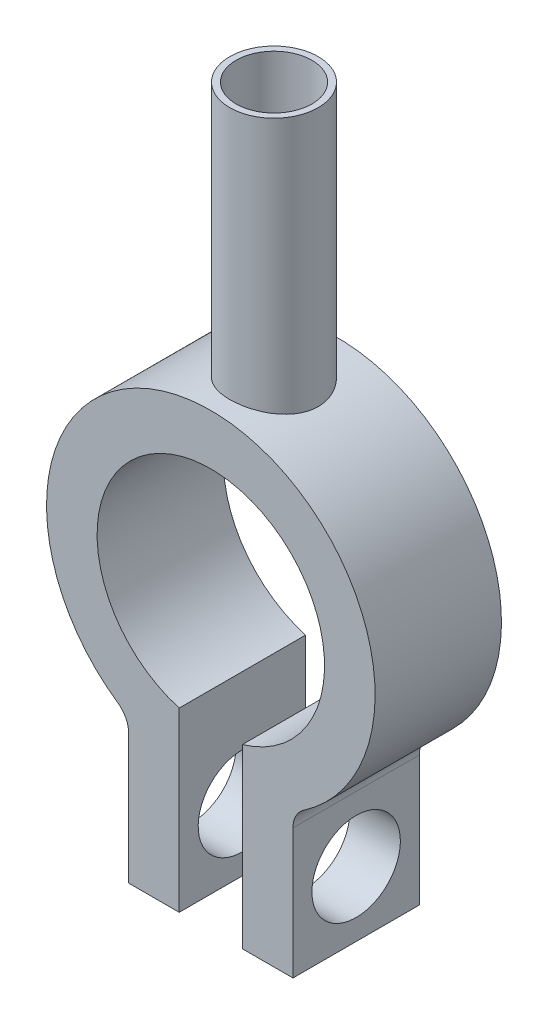
ISO-10303-21;
HEADER;
FILE_DESCRIPTION(('STEP AP214'),'2;1');
FILE_NAME('part.step','',(''),(''),'','','');
FILE_SCHEMA(('AUTOMOTIVE_DESIGN { 1 0 10303 214 1 1 1 1 }'));
ENDSEC;
DATA;
#1=APPLICATION_CONTEXT('core data for automotive mechanical design processes');
#2=APPLICATION_PROTOCOL_DEFINITION('international standard','automotive_design',2000,#1);
#3=PRODUCT_CONTEXT('',#1,'mechanical');
#4=PRODUCT('Part','Part','',(#3));
#5=PRODUCT_RELATED_PRODUCT_CATEGORY('part','',(#4));
#6=PRODUCT_DEFINITION_FORMATION('','',#4);
#7=PRODUCT_DEFINITION_CONTEXT('part definition',#1,'design');
#8=PRODUCT_DEFINITION('design','',#6,#7);
#9=PRODUCT_DEFINITION_SHAPE('','',#8);
#10=(LENGTH_UNIT() NAMED_UNIT(*) SI_UNIT(.MILLI.,.METRE.));
#11=(NAMED_UNIT(*) PLANE_ANGLE_UNIT() SI_UNIT($,.RADIAN.));
#12=(NAMED_UNIT(*) SI_UNIT($,.STERADIAN.) SOLID_ANGLE_UNIT());
#13=UNCERTAINTY_MEASURE_WITH_UNIT(LENGTH_MEASURE(1.E-05),#10,'distance_accuracy_value','');
#14=(GEOMETRIC_REPRESENTATION_CONTEXT(3) GLOBAL_UNCERTAINTY_ASSIGNED_CONTEXT((#13)) GLOBAL_UNIT_ASSIGNED_CONTEXT((#10,
#11,#12)) REPRESENTATION_CONTEXT('',''));
#15=CARTESIAN_POINT('',(0.,0.,0.));
#16=DIRECTION('',(0.,0.,1.));
#17=DIRECTION('',(1.,0.,0.));
#18=AXIS2_PLACEMENT_3D('',#15,#16,#17);
#19=CARTESIAN_POINT('',(0.,11.,5.));
#20=DIRECTION('',(0.,1.,0.));
#21=DIRECTION('',(0.,0.,1.));
#22=AXIS2_PLACEMENT_3D('',#19,#20,#21);
#23=CYLINDRICAL_SURFACE('',#22,3.5);
#24=CARTESIAN_POINT('',(0.,11.,5.));
#25=DIRECTION('',(0.,1.,0.));
#26=DIRECTION('',(0.,0.,1.));
#27=AXIS2_PLACEMENT_3D('',#24,#25,#26);
#28=CIRCLE('',#27,3.5);
#29=CARTESIAN_POINT('',(0.,11.,8.5));
#30=VERTEX_POINT('',#29);
#31=EDGE_CURVE('E11',#30,#30,#28,.T.);
#32=ORIENTED_EDGE('',*,*,#31,.T.);
#33=EDGE_LOOP('',(#32));
#34=FACE_BOUND('',#33,.T.);
#35=CARTESIAN_POINT('',(0.,33.,5.));
#36=DIRECTION('',(0.,1.,0.));
#37=DIRECTION('',(0.,0.,1.));
#38=AXIS2_PLACEMENT_3D('',#35,#36,#37);
#39=CIRCLE('',#38,3.5);
#40=CARTESIAN_POINT('',(0.,33.,8.5));
#41=VERTEX_POINT('',#40);
#42=EDGE_CURVE('E50',#41,#41,#39,.T.);
#43=ORIENTED_EDGE('',*,*,#42,.F.);
#44=EDGE_LOOP('',(#43));
#45=FACE_BOUND('',#44,.T.);
#46=ADVANCED_FACE('F40',(#34,#45),#23,.T.);
#47=CARTESIAN_POINT('',(0.,11.,5.));
#48=DIRECTION('',(0.,1.,0.));
#49=DIRECTION('',(0.,0.,1.));
#50=AXIS2_PLACEMENT_3D('',#47,#48,#49);
#51=PLANE('',#50);
#52=CARTESIAN_POINT('',(0.,11.,5.));
#53=DIRECTION('',(0.,1.,0.));
#54=DIRECTION('',(0.,0.,1.));
#55=AXIS2_PLACEMENT_3D('',#52,#53,#54);
#56=CIRCLE('',#55,3.);
#57=CARTESIAN_POINT('',(0.,11.,8.));
#58=VERTEX_POINT('',#57);
#59=EDGE_CURVE('E46',#58,#58,#56,.T.);
#60=ORIENTED_EDGE('',*,*,#59,.T.);
#61=EDGE_LOOP('',(#60));
#62=FACE_BOUND('',#61,.T.);
#63=ORIENTED_EDGE('',*,*,#31,.F.);
#64=EDGE_LOOP('',(#63));
#65=FACE_BOUND('',#64,.T.);
#66=ADVANCED_FACE('F69',(#62,#65),#51,.F.);
#67=CARTESIAN_POINT('',(0.,11.,5.));
#68=DIRECTION('',(0.,1.,0.));
#69=DIRECTION('',(0.,0.,1.));
#70=AXIS2_PLACEMENT_3D('',#67,#68,#69);
#71=CYLINDRICAL_SURFACE('',#70,3.);
#72=ORIENTED_EDGE('',*,*,#59,.F.);
#73=EDGE_LOOP('',(#72));
#74=FACE_BOUND('',#73,.T.);
#75=CARTESIAN_POINT('',(0.,33.,5.));
#76=DIRECTION('',(0.,1.,0.));
#77=DIRECTION('',(0.,0.,1.));
#78=AXIS2_PLACEMENT_3D('',#75,#76,#77);
#79=CIRCLE('',#78,3.);
#80=CARTESIAN_POINT('',(0.,33.,8.));
#81=VERTEX_POINT('',#80);
#82=EDGE_CURVE('E54',#81,#81,#79,.T.);
#83=ORIENTED_EDGE('',*,*,#82,.T.);
#84=EDGE_LOOP('',(#83));
#85=FACE_BOUND('',#84,.T.);
#86=ADVANCED_FACE('F60',(#74,#85),#71,.F.);
#87=CARTESIAN_POINT('',(0.,33.,5.));
#88=DIRECTION('',(0.,1.,0.));
#89=DIRECTION('',(0.,0.,1.));
#90=AXIS2_PLACEMENT_3D('',#87,#88,#89);
#91=PLANE('',#90);
#92=ORIENTED_EDGE('',*,*,#42,.T.);
#93=EDGE_LOOP('',(#92));
#94=FACE_BOUND('',#93,.T.);
#95=ORIENTED_EDGE('',*,*,#82,.F.);
#96=EDGE_LOOP('',(#95));
#97=FACE_BOUND('',#96,.T.);
#98=ADVANCED_FACE('F62',(#94,#97),#91,.T.);
#99=CLOSED_SHELL('',(#46,#66,#86,#98));
#100=MANIFOLD_SOLID_BREP('B2',#99);
#101=CARTESIAN_POINT('',(0.,0.,10.));
#102=DIRECTION('',(0.,0.,-1.));
#103=DIRECTION('',(-1.,0.,0.));
#104=AXIS2_PLACEMENT_3D('',#101,#102,#103);
#105=CYLINDRICAL_SURFACE('',#104,13.);
#106=CARTESIAN_POINT('',(0.,0.,10.));
#107=DIRECTION('',(0.,0.,1.));
#108=DIRECTION('',(1.,0.,0.));
#109=AXIS2_PLACEMENT_3D('',#106,#107,#108);
#110=CIRCLE('',#109,13.);
#111=CARTESIAN_POINT('',(7.36666666666667,-10.7113128150672,10.));
#112=VERTEX_POINT('',#111);
#113=CARTESIAN_POINT('',(-7.36666666666667,-10.7113128150672,10.));
#114=VERTEX_POINT('',#113);
#115=EDGE_CURVE('E238',#112,#114,#110,.T.);
#116=ORIENTED_EDGE('',*,*,#115,.F.);
#117=DIRECTION('',(0.,0.,-1.));
#118=VECTOR('',#117,1.);
#119=CARTESIAN_POINT('',(7.36666666666667,-10.7113128150672,10.));
#120=LINE('',#119,#118);
#121=CARTESIAN_POINT('',(7.36666666666667,-10.7113128150672,0.));
#122=VERTEX_POINT('',#121);
#123=EDGE_CURVE('E122',#112,#122,#120,.T.);
#124=ORIENTED_EDGE('',*,*,#123,.T.);
#125=CARTESIAN_POINT('',(0.,0.,0.));
#126=DIRECTION('',(0.,0.,1.));
#127=DIRECTION('',(1.,0.,0.));
#128=AXIS2_PLACEMENT_3D('',#125,#126,#127);
#129=CIRCLE('',#128,13.);
#130=CARTESIAN_POINT('',(-7.36666666666667,-10.7113128150672,0.));
#131=VERTEX_POINT('',#130);
#132=EDGE_CURVE('E235',#122,#131,#129,.T.);
#133=ORIENTED_EDGE('',*,*,#132,.T.);
#134=DIRECTION('',(0.,0.,-1.));
#135=VECTOR('',#134,1.);
#136=CARTESIAN_POINT('',(-7.36666666666667,-10.7113128150672,10.));
#137=LINE('',#136,#135);
#138=EDGE_CURVE('E245',#131,#114,#137,.F.);
#139=ORIENTED_EDGE('',*,*,#138,.T.);
#140=EDGE_LOOP('',(#116,#124,#133,#139));
#141=FACE_BOUND('',#140,.T.);
#142=ADVANCED_FACE('F101',(#141),#105,.T.);
#143=CARTESIAN_POINT('',(0.,0.,10.));
#144=DIRECTION('',(0.,0.,1.));
#145=DIRECTION('',(1.,0.,0.));
#146=AXIS2_PLACEMENT_3D('',#143,#144,#145);
#147=PLANE('',#146);
#148=DIRECTION('',(0.,-1.,0.));
#149=VECTOR('',#148,1.);
#150=CARTESIAN_POINT('',(6.5,-8.64580823289529,10.));
#151=LINE('',#150,#149);
#152=CARTESIAN_POINT('',(6.5,-12.3592070943083,10.));
#153=VERTEX_POINT('',#152);
#154=CARTESIAN_POINT('',(6.5,-22.6458082328953,10.));
#155=VERTEX_POINT('',#154);
#156=EDGE_CURVE('E197',#153,#155,#151,.T.);
#157=ORIENTED_EDGE('',*,*,#156,.F.);
#158=CARTESIAN_POINT('',(8.5,-12.3592070943083,10.));
#159=DIRECTION('',(0.,0.,1.));
#160=DIRECTION('',(1.,0.,0.));
#161=AXIS2_PLACEMENT_3D('',#158,#159,#160);
#162=CIRCLE('',#161,2.);
#163=EDGE_CURVE('E109',#153,#112,#162,.F.);
#164=ORIENTED_EDGE('',*,*,#163,.T.);
#165=ORIENTED_EDGE('',*,*,#115,.T.);
#166=CARTESIAN_POINT('',(-8.5,-12.3592070943083,10.));
#167=DIRECTION('',(0.,0.,1.));
#168=DIRECTION('',(1.,0.,0.));
#169=AXIS2_PLACEMENT_3D('',#166,#167,#168);
#170=CIRCLE('',#169,2.);
#171=CARTESIAN_POINT('',(-6.5,-12.3592070943083,10.));
#172=VERTEX_POINT('',#171);
#173=EDGE_CURVE('E250',#114,#172,#170,.F.);
#174=ORIENTED_EDGE('',*,*,#173,.T.);
#175=DIRECTION('',(0.,-1.,0.));
#176=VECTOR('',#175,1.);
#177=CARTESIAN_POINT('',(-6.5,-8.64580823289529,10.));
#178=LINE('',#177,#176);
#179=CARTESIAN_POINT('',(-6.5,-22.6458082328953,10.));
#180=VERTEX_POINT('',#179);
#181=EDGE_CURVE('E220',#172,#180,#178,.T.);
#182=ORIENTED_EDGE('',*,*,#181,.T.);
#183=DIRECTION('',(1.,0.,0.));
#184=VECTOR('',#183,1.);
#185=CARTESIAN_POINT('',(-2.5,-22.6458082328953,10.));
#186=LINE('',#185,#184);
#187=CARTESIAN_POINT('',(-2.5,-22.6458082328953,10.));
#188=VERTEX_POINT('',#187);
#189=EDGE_CURVE('E222',#180,#188,#186,.T.);
#190=ORIENTED_EDGE('',*,*,#189,.T.);
#191=DIRECTION('',(0.,-1.,0.));
#192=VECTOR('',#191,1.);
#193=CARTESIAN_POINT('',(-2.5,0.,10.));
#194=LINE('',#193,#192);
#195=CARTESIAN_POINT('',(-2.5,-8.64580823289529,10.));
#196=VERTEX_POINT('',#195);
#197=EDGE_CURVE('E186',#196,#188,#194,.T.);
#198=ORIENTED_EDGE('',*,*,#197,.F.);
#199=CARTESIAN_POINT('',(0.,0.,10.));
#200=DIRECTION('',(0.,0.,1.));
#201=DIRECTION('',(1.,0.,0.));
#202=AXIS2_PLACEMENT_3D('',#199,#200,#201);
#203=CIRCLE('',#202,9.);
#204=CARTESIAN_POINT('',(2.5,-8.64580823289529,10.));
#205=VERTEX_POINT('',#204);
#206=EDGE_CURVE('E182',#205,#196,#203,.T.);
#207=ORIENTED_EDGE('',*,*,#206,.F.);
#208=DIRECTION('',(0.,1.,0.));
#209=VECTOR('',#208,1.);
#210=CARTESIAN_POINT('',(2.5,0.,10.));
#211=LINE('',#210,#209);
#212=CARTESIAN_POINT('',(2.5,-22.6458082328953,10.));
#213=VERTEX_POINT('',#212);
#214=EDGE_CURVE('E175',#213,#205,#211,.T.);
#215=ORIENTED_EDGE('',*,*,#214,.F.);
#216=DIRECTION('',(-1.,0.,0.));
#217=VECTOR('',#216,1.);
#218=CARTESIAN_POINT('',(2.5,-22.6458082328953,10.));
#219=LINE('',#218,#217);
#220=EDGE_CURVE('E179',#155,#213,#219,.T.);
#221=ORIENTED_EDGE('',*,*,#220,.F.);
#222=EDGE_LOOP('',(#157,#164,#165,#174,#182,#190,#198,#207,#215,#221));
#223=FACE_BOUND('',#222,.T.);
#224=ADVANCED_FACE('F177',(#223),#147,.T.);
#225=CARTESIAN_POINT('',(0.,0.,0.));
#226=DIRECTION('',(0.,0.,1.));
#227=DIRECTION('',(1.,0.,0.));
#228=AXIS2_PLACEMENT_3D('',#225,#226,#227);
#229=PLANE('',#228);
#230=ORIENTED_EDGE('',*,*,#132,.F.);
#231=CARTESIAN_POINT('',(8.5,-12.3592070943083,0.));
#232=DIRECTION('',(0.,0.,1.));
#233=DIRECTION('',(1.,0.,0.));
#234=AXIS2_PLACEMENT_3D('',#231,#232,#233);
#235=CIRCLE('',#234,2.);
#236=CARTESIAN_POINT('',(6.5,-12.3592070943083,0.));
#237=VERTEX_POINT('',#236);
#238=EDGE_CURVE('E38',#122,#237,#235,.T.);
#239=ORIENTED_EDGE('',*,*,#238,.T.);
#240=DIRECTION('',(0.,1.,0.));
#241=VECTOR('',#240,1.);
#242=CARTESIAN_POINT('',(6.5,-8.64580823289529,0.));
#243=LINE('',#242,#241);
#244=CARTESIAN_POINT('',(6.5,-22.6458082328953,0.));
#245=VERTEX_POINT('',#244);
#246=EDGE_CURVE('E209',#245,#237,#243,.T.);
#247=ORIENTED_EDGE('',*,*,#246,.F.);
#248=DIRECTION('',(1.,0.,0.));
#249=VECTOR('',#248,1.);
#250=CARTESIAN_POINT('',(2.5,-22.6458082328953,0.));
#251=LINE('',#250,#249);
#252=CARTESIAN_POINT('',(2.5,-22.6458082328953,0.));
#253=VERTEX_POINT('',#252);
#254=EDGE_CURVE('E211',#253,#245,#251,.T.);
#255=ORIENTED_EDGE('',*,*,#254,.F.);
#256=DIRECTION('',(0.,1.,0.));
#257=VECTOR('',#256,1.);
#258=CARTESIAN_POINT('',(2.5,0.,0.));
#259=LINE('',#258,#257);
#260=CARTESIAN_POINT('',(2.5,-8.64580823289529,0.));
#261=VERTEX_POINT('',#260);
#262=EDGE_CURVE('E192',#253,#261,#259,.T.);
#263=ORIENTED_EDGE('',*,*,#262,.T.);
#264=CARTESIAN_POINT('',(0.,0.,0.));
#265=DIRECTION('',(0.,0.,1.));
#266=DIRECTION('',(1.,0.,0.));
#267=AXIS2_PLACEMENT_3D('',#264,#265,#266);
#268=CIRCLE('',#267,9.);
#269=CARTESIAN_POINT('',(-2.5,-8.64580823289529,0.));
#270=VERTEX_POINT('',#269);
#271=EDGE_CURVE('E232',#261,#270,#268,.T.);
#272=ORIENTED_EDGE('',*,*,#271,.T.);
#273=DIRECTION('',(0.,-1.,0.));
#274=VECTOR('',#273,1.);
#275=CARTESIAN_POINT('',(-2.5,0.,0.));
#276=LINE('',#275,#274);
#277=CARTESIAN_POINT('',(-2.5,-22.6458082328953,0.));
#278=VERTEX_POINT('',#277);
#279=EDGE_CURVE('E185',#270,#278,#276,.T.);
#280=ORIENTED_EDGE('',*,*,#279,.T.);
#281=DIRECTION('',(-1.,0.,0.));
#282=VECTOR('',#281,1.);
#283=CARTESIAN_POINT('',(-2.5,-22.6458082328953,0.));
#284=LINE('',#283,#282);
#285=CARTESIAN_POINT('',(-6.5,-22.6458082328953,0.));
#286=VERTEX_POINT('',#285);
#287=EDGE_CURVE('E217',#278,#286,#284,.T.);
#288=ORIENTED_EDGE('',*,*,#287,.T.);
#289=DIRECTION('',(0.,1.,0.));
#290=VECTOR('',#289,1.);
#291=CARTESIAN_POINT('',(-6.5,-8.64580823289529,0.));
#292=LINE('',#291,#290);
#293=CARTESIAN_POINT('',(-6.5,-12.3592070943083,0.));
#294=VERTEX_POINT('',#293);
#295=EDGE_CURVE('E214',#286,#294,#292,.T.);
#296=ORIENTED_EDGE('',*,*,#295,.T.);
#297=CARTESIAN_POINT('',(-8.5,-12.3592070943083,0.));
#298=DIRECTION('',(0.,0.,1.));
#299=DIRECTION('',(1.,0.,0.));
#300=AXIS2_PLACEMENT_3D('',#297,#298,#299);
#301=CIRCLE('',#300,2.);
#302=EDGE_CURVE('E252',#294,#131,#301,.T.);
#303=ORIENTED_EDGE('',*,*,#302,.T.);
#304=EDGE_LOOP('',(#230,#239,#247,#255,#263,#272,#280,#288,#296,#303));
#305=FACE_BOUND('',#304,.T.);
#306=ADVANCED_FACE('F265',(#305),#229,.F.);
#307=CARTESIAN_POINT('',(0.,0.,10.));
#308=DIRECTION('',(0.,0.,-1.));
#309=DIRECTION('',(-1.,0.,0.));
#310=AXIS2_PLACEMENT_3D('',#307,#308,#309);
#311=CYLINDRICAL_SURFACE('',#310,9.);
#312=DIRECTION('',(0.,0.,-1.));
#313=VECTOR('',#312,1.);
#314=CARTESIAN_POINT('',(-2.5,-8.64580823289529,10.));
#315=LINE('',#314,#313);
#316=EDGE_CURVE('E243',#270,#196,#315,.F.);
#317=ORIENTED_EDGE('',*,*,#316,.F.);
#318=ORIENTED_EDGE('',*,*,#271,.F.);
#319=DIRECTION('',(0.,0.,-1.));
#320=VECTOR('',#319,1.);
#321=CARTESIAN_POINT('',(2.5,-8.64580823289529,10.));
#322=LINE('',#321,#320);
#323=EDGE_CURVE('E240',#205,#261,#322,.T.);
#324=ORIENTED_EDGE('',*,*,#323,.F.);
#325=ORIENTED_EDGE('',*,*,#206,.T.);
#326=EDGE_LOOP('',(#317,#318,#324,#325));
#327=FACE_BOUND('',#326,.T.);
#328=ADVANCED_FACE('F285',(#327),#311,.F.);
#329=CARTESIAN_POINT('',(2.5,0.,0.));
#330=DIRECTION('',(1.,0.,0.));
#331=DIRECTION('',(0.,1.,0.));
#332=AXIS2_PLACEMENT_3D('',#329,#330,#331);
#333=PLANE('',#332);
#334=CARTESIAN_POINT('',(2.50000000000001,-17.5025076636018,5.));
#335=DIRECTION('',(1.,0.,0.));
#336=DIRECTION('',(0.,1.,0.));
#337=AXIS2_PLACEMENT_3D('',#334,#335,#336);
#338=CIRCLE('',#337,3.5);
#339=CARTESIAN_POINT('',(2.5,-14.0025076636018,5.));
#340=VERTEX_POINT('',#339);
#341=EDGE_CURVE('E202',#340,#340,#338,.T.);
#342=ORIENTED_EDGE('',*,*,#341,.T.);
#343=EDGE_LOOP('',(#342));
#344=FACE_BOUND('',#343,.T.);
#345=ORIENTED_EDGE('',*,*,#214,.T.);
#346=ORIENTED_EDGE('',*,*,#323,.T.);
#347=ORIENTED_EDGE('',*,*,#262,.F.);
#348=DIRECTION('',(0.,0.,1.));
#349=VECTOR('',#348,1.);
#350=CARTESIAN_POINT('',(2.5,-22.6458082328953,-14.560219778561));
#351=LINE('',#350,#349);
#352=EDGE_CURVE('E189',#253,#213,#351,.T.);
#353=ORIENTED_EDGE('',*,*,#352,.T.);
#354=EDGE_LOOP('',(#345,#346,#347,#353));
#355=FACE_BOUND('',#354,.T.);
#356=ADVANCED_FACE('F190',(#344,#355),#333,.F.);
#357=CARTESIAN_POINT('',(-2.5,0.,0.));
#358=DIRECTION('',(-1.,0.,0.));
#359=DIRECTION('',(0.,-1.,0.));
#360=AXIS2_PLACEMENT_3D('',#357,#358,#359);
#361=PLANE('',#360);
#362=CARTESIAN_POINT('',(-2.5,-17.5025076636018,5.));
#363=DIRECTION('',(-1.,0.,0.));
#364=DIRECTION('',(0.,-1.,0.));
#365=AXIS2_PLACEMENT_3D('',#362,#363,#364);
#366=CIRCLE('',#365,3.5);
#367=CARTESIAN_POINT('',(-2.5,-21.0025076636018,5.));
#368=VERTEX_POINT('',#367);
#369=EDGE_CURVE('E206',#368,#368,#366,.T.);
#370=ORIENTED_EDGE('',*,*,#369,.T.);
#371=EDGE_LOOP('',(#370));
#372=FACE_BOUND('',#371,.T.);
#373=ORIENTED_EDGE('',*,*,#279,.F.);
#374=ORIENTED_EDGE('',*,*,#316,.T.);
#375=ORIENTED_EDGE('',*,*,#197,.T.);
#376=DIRECTION('',(0.,0.,1.));
#377=VECTOR('',#376,1.);
#378=CARTESIAN_POINT('',(-2.5,-22.6458082328953,-14.560219778561));
#379=LINE('',#378,#377);
#380=EDGE_CURVE('E218',#278,#188,#379,.T.);
#381=ORIENTED_EDGE('',*,*,#380,.F.);
#382=EDGE_LOOP('',(#373,#374,#375,#381));
#383=FACE_BOUND('',#382,.T.);
#384=ADVANCED_FACE('F287',(#372,#383),#361,.F.);
#385=CARTESIAN_POINT('',(-6.5,-8.64580823289529,-14.560219778561));
#386=DIRECTION('',(-1.,0.,0.));
#387=DIRECTION('',(0.,-1.,0.));
#388=AXIS2_PLACEMENT_3D('',#385,#386,#387);
#389=PLANE('',#388);
#390=CARTESIAN_POINT('',(-6.5,-17.5025076636018,5.));
#391=DIRECTION('',(-1.,0.,0.));
#392=DIRECTION('',(0.,-1.,0.));
#393=AXIS2_PLACEMENT_3D('',#390,#391,#392);
#394=CIRCLE('',#393,3.5);
#395=CARTESIAN_POINT('',(-6.5,-21.0025076636018,5.));
#396=VERTEX_POINT('',#395);
#397=EDGE_CURVE('E361',#396,#396,#394,.T.);
#398=ORIENTED_EDGE('',*,*,#397,.F.);
#399=EDGE_LOOP('',(#398));
#400=FACE_BOUND('',#399,.T.);
#401=ORIENTED_EDGE('',*,*,#181,.F.);
#402=DIRECTION('',(0.,0.,-1.));
#403=VECTOR('',#402,1.);
#404=CARTESIAN_POINT('',(-6.5,-12.3592070943083,-14.560219778561));
#405=LINE('',#404,#403);
#406=EDGE_CURVE('E248',#172,#294,#405,.T.);
#407=ORIENTED_EDGE('',*,*,#406,.T.);
#408=ORIENTED_EDGE('',*,*,#295,.F.);
#409=DIRECTION('',(0.,0.,1.));
#410=VECTOR('',#409,1.);
#411=CARTESIAN_POINT('',(-6.5,-22.6458082328953,-14.560219778561));
#412=LINE('',#411,#410);
#413=EDGE_CURVE('E225',#286,#180,#412,.T.);
#414=ORIENTED_EDGE('',*,*,#413,.T.);
#415=EDGE_LOOP('',(#401,#407,#408,#414));
#416=FACE_BOUND('',#415,.T.);
#417=ADVANCED_FACE('F274',(#400,#416),#389,.T.);
#418=CARTESIAN_POINT('',(-2.5,-22.6458082328953,-14.560219778561));
#419=DIRECTION('',(0.,-1.,0.));
#420=DIRECTION('',(0.,0.,-1.));
#421=AXIS2_PLACEMENT_3D('',#418,#419,#420);
#422=PLANE('',#421);
#423=ORIENTED_EDGE('',*,*,#287,.F.);
#424=ORIENTED_EDGE('',*,*,#380,.T.);
#425=ORIENTED_EDGE('',*,*,#189,.F.);
#426=ORIENTED_EDGE('',*,*,#413,.F.);
#427=EDGE_LOOP('',(#423,#424,#425,#426));
#428=FACE_BOUND('',#427,.T.);
#429=ADVANCED_FACE('F280',(#428),#422,.T.);
#430=CARTESIAN_POINT('',(6.5,-8.64580823289529,-14.560219778561));
#431=DIRECTION('',(-1.,0.,0.));
#432=DIRECTION('',(0.,-1.,0.));
#433=AXIS2_PLACEMENT_3D('',#430,#431,#432);
#434=PLANE('',#433);
#435=CARTESIAN_POINT('',(6.5,-17.5025076636018,5.));
#436=DIRECTION('',(1.,0.,0.));
#437=DIRECTION('',(0.,1.,0.));
#438=AXIS2_PLACEMENT_3D('',#435,#436,#437);
#439=CIRCLE('',#438,3.5);
#440=CARTESIAN_POINT('',(6.5,-14.0025076636018,5.));
#441=VERTEX_POINT('',#440);
#442=EDGE_CURVE('E364',#441,#441,#439,.T.);
#443=ORIENTED_EDGE('',*,*,#442,.F.);
#444=EDGE_LOOP('',(#443));
#445=FACE_BOUND('',#444,.T.);
#446=ORIENTED_EDGE('',*,*,#246,.T.);
#447=DIRECTION('',(0.,0.,1.));
#448=VECTOR('',#447,1.);
#449=CARTESIAN_POINT('',(6.5,-12.3592070943083,10.));
#450=LINE('',#449,#448);
#451=EDGE_CURVE('E255',#237,#153,#450,.T.);
#452=ORIENTED_EDGE('',*,*,#451,.T.);
#453=ORIENTED_EDGE('',*,*,#156,.T.);
#454=DIRECTION('',(0.,0.,1.));
#455=VECTOR('',#454,1.);
#456=CARTESIAN_POINT('',(6.5,-22.6458082328953,-14.560219778561));
#457=LINE('',#456,#455);
#458=EDGE_CURVE('E196',#245,#155,#457,.T.);
#459=ORIENTED_EDGE('',*,*,#458,.F.);
#460=EDGE_LOOP('',(#446,#452,#453,#459));
#461=FACE_BOUND('',#460,.T.);
#462=ADVANCED_FACE('F261',(#445,#461),#434,.F.);
#463=CARTESIAN_POINT('',(2.5,-22.6458082328953,-14.560219778561));
#464=DIRECTION('',(0.,1.,0.));
#465=DIRECTION('',(0.,0.,1.));
#466=AXIS2_PLACEMENT_3D('',#463,#464,#465);
#467=PLANE('',#466);
#468=ORIENTED_EDGE('',*,*,#352,.F.);
#469=ORIENTED_EDGE('',*,*,#254,.T.);
#470=ORIENTED_EDGE('',*,*,#458,.T.);
#471=ORIENTED_EDGE('',*,*,#220,.T.);
#472=EDGE_LOOP('',(#468,#469,#470,#471));
#473=FACE_BOUND('',#472,.T.);
#474=ADVANCED_FACE('F200',(#473),#467,.F.);
#475=CARTESIAN_POINT('',(-8.5,-12.3592070943083,10.));
#476=DIRECTION('',(0.,0.,-1.));
#477=DIRECTION('',(-1.,0.,0.));
#478=AXIS2_PLACEMENT_3D('',#475,#476,#477);
#479=CYLINDRICAL_SURFACE('',#478,2.);
#480=ORIENTED_EDGE('',*,*,#302,.F.);
#481=ORIENTED_EDGE('',*,*,#406,.F.);
#482=ORIENTED_EDGE('',*,*,#173,.F.);
#483=ORIENTED_EDGE('',*,*,#138,.F.);
#484=EDGE_LOOP('',(#480,#481,#482,#483));
#485=FACE_BOUND('',#484,.T.);
#486=ADVANCED_FACE('F270',(#485),#479,.F.);
#487=CARTESIAN_POINT('',(8.5,-12.3592070943083,10.));
#488=DIRECTION('',(0.,0.,-1.));
#489=DIRECTION('',(-1.,0.,0.));
#490=AXIS2_PLACEMENT_3D('',#487,#488,#489);
#491=CYLINDRICAL_SURFACE('',#490,2.);
#492=ORIENTED_EDGE('',*,*,#238,.F.);
#493=ORIENTED_EDGE('',*,*,#123,.F.);
#494=ORIENTED_EDGE('',*,*,#163,.F.);
#495=ORIENTED_EDGE('',*,*,#451,.F.);
#496=EDGE_LOOP('',(#492,#493,#494,#495));
#497=FACE_BOUND('',#496,.T.);
#498=ADVANCED_FACE('F103',(#497),#491,.F.);
#499=CARTESIAN_POINT('',(-13.,-17.5025076636018,5.));
#500=DIRECTION('',(1.,0.,0.));
#501=DIRECTION('',(0.,1.,0.));
#502=AXIS2_PLACEMENT_3D('',#499,#500,#501);
#503=CYLINDRICAL_SURFACE('',#502,3.5);
#504=ORIENTED_EDGE('',*,*,#442,.T.);
#505=EDGE_LOOP('',(#504));
#506=FACE_BOUND('',#505,.T.);
#507=ORIENTED_EDGE('',*,*,#341,.F.);
#508=EDGE_LOOP('',(#507));
#509=FACE_BOUND('',#508,.T.);
#510=ADVANCED_FACE('F313',(#506,#509),#503,.F.);
#511=ORIENTED_EDGE('',*,*,#397,.T.);
#512=EDGE_LOOP('',(#511));
#513=FACE_BOUND('',#512,.T.);
#514=ORIENTED_EDGE('',*,*,#369,.F.);
#515=EDGE_LOOP('',(#514));
#516=FACE_BOUND('',#515,.T.);
#517=ADVANCED_FACE('F345',(#513,#516),#503,.F.);
#518=CLOSED_SHELL('',(#142,#224,#306,#328,#356,#384,#417,#429,#462,#474,#486,#498,#510,#517));
#519=MANIFOLD_SOLID_BREP('B6',#518);
#520=ADVANCED_BREP_SHAPE_REPRESENTATION('',(#18,#100,#519),#14);
#521=SHAPE_DEFINITION_REPRESENTATION(#9,#520);
ENDSEC;
END-ISO-10303-21;
